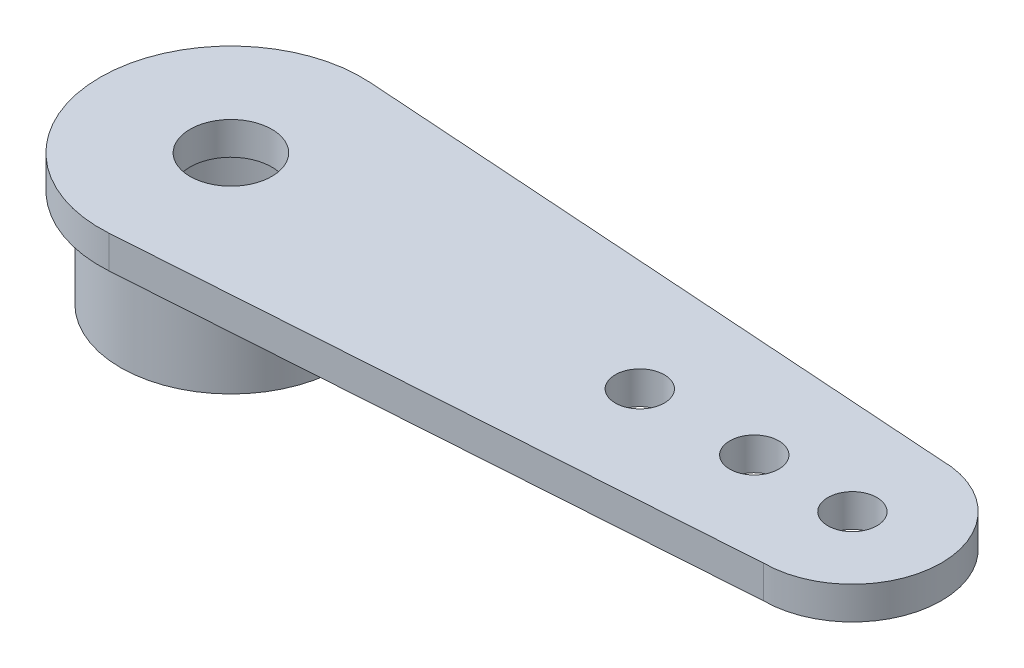
ISO-10303-21;
HEADER;
FILE_DESCRIPTION(('STEP AP214'),'2;1');
FILE_NAME('part.step','',(''),(''),'','','');
FILE_SCHEMA(('AUTOMOTIVE_DESIGN { 1 0 10303 214 1 1 1 1 }'));
ENDSEC;
DATA;
#1=APPLICATION_CONTEXT('core data for automotive mechanical design processes');
#2=APPLICATION_PROTOCOL_DEFINITION('international standard','automotive_design',2000,#1);
#3=PRODUCT_CONTEXT('',#1,'mechanical');
#4=PRODUCT('Part','Part','',(#3));
#5=PRODUCT_RELATED_PRODUCT_CATEGORY('part','',(#4));
#6=PRODUCT_DEFINITION_FORMATION('','',#4);
#7=PRODUCT_DEFINITION_CONTEXT('part definition',#1,'design');
#8=PRODUCT_DEFINITION('design','',#6,#7);
#9=PRODUCT_DEFINITION_SHAPE('','',#8);
#10=(LENGTH_UNIT() NAMED_UNIT(*) SI_UNIT(.MILLI.,.METRE.));
#11=(NAMED_UNIT(*) PLANE_ANGLE_UNIT() SI_UNIT($,.RADIAN.));
#12=(NAMED_UNIT(*) SI_UNIT($,.STERADIAN.) SOLID_ANGLE_UNIT());
#13=UNCERTAINTY_MEASURE_WITH_UNIT(LENGTH_MEASURE(1.E-05),#10,'distance_accuracy_value','');
#14=(GEOMETRIC_REPRESENTATION_CONTEXT(3) GLOBAL_UNCERTAINTY_ASSIGNED_CONTEXT((#13)) GLOBAL_UNIT_ASSIGNED_CONTEXT((#10,
#11,#12)) REPRESENTATION_CONTEXT('',''));
#15=CARTESIAN_POINT('',(0.,0.,0.));
#16=DIRECTION('',(0.,0.,1.));
#17=DIRECTION('',(1.,0.,0.));
#18=AXIS2_PLACEMENT_3D('',#15,#16,#17);
#19=CARTESIAN_POINT('',(0.,0.,0.));
#20=DIRECTION('',(0.,1.,0.));
#21=DIRECTION('',(0.,0.,1.));
#22=AXIS2_PLACEMENT_3D('',#19,#20,#21);
#23=PLANE('',#22);
#24=CARTESIAN_POINT('',(0.,0.,0.));
#25=DIRECTION('',(0.,1.,0.));
#26=DIRECTION('',(0.,0.,1.));
#27=AXIS2_PLACEMENT_3D('',#24,#25,#26);
#28=CIRCLE('',#27,3.429);
#29=CARTESIAN_POINT('',(0.,0.,-3.429));
#30=VERTEX_POINT('',#29);
#31=EDGE_CURVE('E37',#30,#30,#28,.T.);
#32=ORIENTED_EDGE('',*,*,#31,.F.);
#33=EDGE_LOOP('',(#32));
#34=FACE_BOUND('',#33,.T.);
#35=CARTESIAN_POINT('',(0.,0.,0.));
#36=DIRECTION('',(0.,1.,0.));
#37=DIRECTION('',(0.,0.,1.));
#38=AXIS2_PLACEMENT_3D('',#35,#36,#37);
#39=CIRCLE('',#38,2.794);
#40=CARTESIAN_POINT('',(0.,0.,-2.794));
#41=VERTEX_POINT('',#40);
#42=EDGE_CURVE('E138',#41,#41,#39,.T.);
#43=ORIENTED_EDGE('',*,*,#42,.T.);
#44=EDGE_LOOP('',(#43));
#45=FACE_BOUND('',#44,.T.);
#46=ADVANCED_FACE('F33',(#34,#45),#23,.F.);
#47=CARTESIAN_POINT('',(0.,3.048,0.));
#48=DIRECTION('',(0.,-1.,0.));
#49=DIRECTION('',(0.,0.,-1.));
#50=AXIS2_PLACEMENT_3D('',#47,#48,#49);
#51=CYLINDRICAL_SURFACE('',#50,3.429);
#52=CARTESIAN_POINT('',(0.,3.048,0.));
#53=DIRECTION('',(0.,1.,0.));
#54=DIRECTION('',(0.,0.,1.));
#55=AXIS2_PLACEMENT_3D('',#52,#53,#54);
#56=CIRCLE('',#55,3.429);
#57=CARTESIAN_POINT('',(0.,3.048,-3.429));
#58=VERTEX_POINT('',#57);
#59=EDGE_CURVE('E11',#58,#58,#56,.T.);
#60=CARTESIAN_POINT('',(0.,3.048,-3.429));
#61=CARTESIAN_POINT('',(0.,3.01625,-3.429));
#62=CARTESIAN_POINT('',(0.,2.9845,-3.429));
#63=CARTESIAN_POINT('',(0.,2.921,-3.429));
#64=CARTESIAN_POINT('',(0.,2.88925,-3.429));
#65=CARTESIAN_POINT('',(0.,2.82575,-3.429));
#66=CARTESIAN_POINT('',(0.,2.794,-3.429));
#67=CARTESIAN_POINT('',(0.,2.7305,-3.429));
#68=CARTESIAN_POINT('',(0.,2.69875,-3.429));
#69=CARTESIAN_POINT('',(0.,2.63525,-3.429));
#70=CARTESIAN_POINT('',(0.,2.6035,-3.429));
#71=CARTESIAN_POINT('',(0.,2.54,-3.429));
#72=CARTESIAN_POINT('',(0.,2.50825,-3.429));
#73=CARTESIAN_POINT('',(0.,2.44475,-3.429));
#74=CARTESIAN_POINT('',(0.,2.413,-3.429));
#75=CARTESIAN_POINT('',(0.,2.3495,-3.429));
#76=CARTESIAN_POINT('',(0.,2.31775,-3.429));
#77=CARTESIAN_POINT('',(0.,2.25425,-3.429));
#78=CARTESIAN_POINT('',(0.,2.2225,-3.429));
#79=CARTESIAN_POINT('',(0.,2.159,-3.429));
#80=CARTESIAN_POINT('',(0.,2.12725,-3.429));
#81=CARTESIAN_POINT('',(0.,2.06375,-3.429));
#82=CARTESIAN_POINT('',(0.,2.032,-3.429));
#83=CARTESIAN_POINT('',(0.,1.9685,-3.429));
#84=CARTESIAN_POINT('',(0.,1.93675,-3.429));
#85=CARTESIAN_POINT('',(0.,1.87325,-3.429));
#86=CARTESIAN_POINT('',(0.,1.8415,-3.429));
#87=CARTESIAN_POINT('',(0.,1.778,-3.429));
#88=CARTESIAN_POINT('',(0.,1.74625,-3.429));
#89=CARTESIAN_POINT('',(0.,1.68275,-3.429));
#90=CARTESIAN_POINT('',(0.,1.651,-3.429));
#91=CARTESIAN_POINT('',(0.,1.5875,-3.429));
#92=CARTESIAN_POINT('',(0.,1.55575,-3.429));
#93=CARTESIAN_POINT('',(0.,1.49225,-3.429));
#94=CARTESIAN_POINT('',(0.,1.4605,-3.429));
#95=CARTESIAN_POINT('',(0.,1.397,-3.429));
#96=CARTESIAN_POINT('',(0.,1.36525,-3.429));
#97=CARTESIAN_POINT('',(0.,1.30175,-3.429));
#98=CARTESIAN_POINT('',(0.,1.27,-3.429));
#99=CARTESIAN_POINT('',(0.,1.2065,-3.429));
#100=CARTESIAN_POINT('',(0.,1.17475,-3.429));
#101=CARTESIAN_POINT('',(0.,1.11125,-3.429));
#102=CARTESIAN_POINT('',(0.,1.0795,-3.429));
#103=CARTESIAN_POINT('',(0.,1.016,-3.429));
#104=CARTESIAN_POINT('',(0.,0.98425,-3.429));
#105=CARTESIAN_POINT('',(0.,0.92075,-3.429));
#106=CARTESIAN_POINT('',(0.,0.889,-3.429));
#107=CARTESIAN_POINT('',(0.,0.8255,-3.429));
#108=CARTESIAN_POINT('',(0.,0.79375,-3.429));
#109=CARTESIAN_POINT('',(0.,0.73025,-3.429));
#110=CARTESIAN_POINT('',(0.,0.6985,-3.429));
#111=CARTESIAN_POINT('',(0.,0.635,-3.429));
#112=CARTESIAN_POINT('',(0.,0.60325,-3.429));
#113=CARTESIAN_POINT('',(0.,0.53975,-3.429));
#114=CARTESIAN_POINT('',(0.,0.508,-3.429));
#115=CARTESIAN_POINT('',(0.,0.4445,-3.429));
#116=CARTESIAN_POINT('',(0.,0.41275,-3.429));
#117=CARTESIAN_POINT('',(0.,0.34925,-3.429));
#118=CARTESIAN_POINT('',(0.,0.3175,-3.429));
#119=CARTESIAN_POINT('',(0.,0.254,-3.429));
#120=CARTESIAN_POINT('',(0.,0.22225,-3.429));
#121=CARTESIAN_POINT('',(0.,0.15875,-3.429));
#122=CARTESIAN_POINT('',(0.,0.127,-3.429));
#123=CARTESIAN_POINT('',(0.,0.0634999999999999,-3.429));
#124=CARTESIAN_POINT('',(0.,0.03175,-3.429));
#125=CARTESIAN_POINT('',(0.,0.,-3.429));
#126=B_SPLINE_CURVE_WITH_KNOTS('',3,(#60,#61,#62,#63,#64,#65,#66,#67,#68,#69,#70,#71,#72,#73,
#74,#75,#76,#77,#78,#79,#80,#81,#82,#83,#84,#85,#86,#87,#88,#89,#90,#91,#92,#93,#94,#95,#96,#97,
#98,#99,#100,#101,#102,#103,#104,#105,#106,#107,#108,#109,#110,#111,#112,#113,#114,#115,#116,
#117,#118,#119,#120,#121,#122,#123,#124,#125),.UNSPECIFIED.,.F.,.F.,(4,2,2,2,2,2,2,2,2,2,2,2,2,
2,2,2,2,2,2,2,2,2,2,2,2,2,2,2,2,2,2,2,4),(0.,0.0952500000000003,0.1905,0.28575,0.381,0.47625,
0.5715,0.66675,0.762,0.85725,0.9525,1.04775,1.143,1.23825,1.3335,1.42875,1.524,1.61925,1.7145,
1.80975,1.905,2.00025,2.0955,2.19075,2.286,2.38125,2.4765,2.57175,2.667,2.76225,2.8575,2.95275,
3.048),.UNSPECIFIED.);
#127=EDGE_CURVE('BSEAM35',#58,#30,#126,.T.);
#128=ORIENTED_EDGE('',*,*,#59,.F.);
#129=ORIENTED_EDGE('',*,*,#31,.T.);
#130=ORIENTED_EDGE('',*,*,#127,.T.);
#131=ORIENTED_EDGE('',*,*,#127,.F.);
#132=EDGE_LOOP('',(#128,#130,#129,#131));
#133=FACE_BOUND('',#132,.T.);
#134=ADVANCED_FACE('F35',(#133),#51,.T.);
#135=CARTESIAN_POINT('',(0.,3.048,0.));
#136=DIRECTION('',(0.,-1.,0.));
#137=DIRECTION('',(0.,0.,-1.));
#138=AXIS2_PLACEMENT_3D('',#135,#136,#137);
#139=CYLINDRICAL_SURFACE('',#138,2.794);
#140=CARTESIAN_POINT('',(0.,3.048,0.));
#141=DIRECTION('',(0.,1.,0.));
#142=DIRECTION('',(0.,0.,1.));
#143=AXIS2_PLACEMENT_3D('',#140,#141,#142);
#144=CIRCLE('',#143,2.794);
#145=CARTESIAN_POINT('',(0.,3.048,-2.794));
#146=VERTEX_POINT('',#145);
#147=EDGE_CURVE('E135',#146,#146,#144,.T.);
#148=CARTESIAN_POINT('',(0.,3.048,-2.794));
#149=CARTESIAN_POINT('',(0.,3.01625,-2.794));
#150=CARTESIAN_POINT('',(0.,2.9845,-2.794));
#151=CARTESIAN_POINT('',(0.,2.921,-2.794));
#152=CARTESIAN_POINT('',(0.,2.88925,-2.794));
#153=CARTESIAN_POINT('',(0.,2.82575,-2.794));
#154=CARTESIAN_POINT('',(0.,2.794,-2.794));
#155=CARTESIAN_POINT('',(0.,2.7305,-2.794));
#156=CARTESIAN_POINT('',(0.,2.69875,-2.794));
#157=CARTESIAN_POINT('',(0.,2.63525,-2.794));
#158=CARTESIAN_POINT('',(0.,2.6035,-2.794));
#159=CARTESIAN_POINT('',(0.,2.54,-2.794));
#160=CARTESIAN_POINT('',(0.,2.50825,-2.794));
#161=CARTESIAN_POINT('',(0.,2.44475,-2.794));
#162=CARTESIAN_POINT('',(0.,2.413,-2.794));
#163=CARTESIAN_POINT('',(0.,2.3495,-2.794));
#164=CARTESIAN_POINT('',(0.,2.31775,-2.794));
#165=CARTESIAN_POINT('',(0.,2.25425,-2.794));
#166=CARTESIAN_POINT('',(0.,2.2225,-2.794));
#167=CARTESIAN_POINT('',(0.,2.159,-2.794));
#168=CARTESIAN_POINT('',(0.,2.12725,-2.794));
#169=CARTESIAN_POINT('',(0.,2.06375,-2.794));
#170=CARTESIAN_POINT('',(0.,2.032,-2.794));
#171=CARTESIAN_POINT('',(0.,1.9685,-2.794));
#172=CARTESIAN_POINT('',(0.,1.93675,-2.794));
#173=CARTESIAN_POINT('',(0.,1.87325,-2.794));
#174=CARTESIAN_POINT('',(0.,1.8415,-2.794));
#175=CARTESIAN_POINT('',(0.,1.778,-2.794));
#176=CARTESIAN_POINT('',(0.,1.74625,-2.794));
#177=CARTESIAN_POINT('',(0.,1.68275,-2.794));
#178=CARTESIAN_POINT('',(0.,1.651,-2.794));
#179=CARTESIAN_POINT('',(0.,1.5875,-2.794));
#180=CARTESIAN_POINT('',(0.,1.55575,-2.794));
#181=CARTESIAN_POINT('',(0.,1.49225,-2.794));
#182=CARTESIAN_POINT('',(0.,1.4605,-2.794));
#183=CARTESIAN_POINT('',(0.,1.397,-2.794));
#184=CARTESIAN_POINT('',(0.,1.36525,-2.794));
#185=CARTESIAN_POINT('',(0.,1.30175,-2.794));
#186=CARTESIAN_POINT('',(0.,1.27,-2.794));
#187=CARTESIAN_POINT('',(0.,1.2065,-2.794));
#188=CARTESIAN_POINT('',(0.,1.17475,-2.794));
#189=CARTESIAN_POINT('',(0.,1.11125,-2.794));
#190=CARTESIAN_POINT('',(0.,1.0795,-2.794));
#191=CARTESIAN_POINT('',(0.,1.016,-2.794));
#192=CARTESIAN_POINT('',(0.,0.98425,-2.794));
#193=CARTESIAN_POINT('',(0.,0.92075,-2.794));
#194=CARTESIAN_POINT('',(0.,0.889,-2.794));
#195=CARTESIAN_POINT('',(0.,0.8255,-2.794));
#196=CARTESIAN_POINT('',(0.,0.79375,-2.794));
#197=CARTESIAN_POINT('',(0.,0.73025,-2.794));
#198=CARTESIAN_POINT('',(0.,0.6985,-2.794));
#199=CARTESIAN_POINT('',(0.,0.635,-2.794));
#200=CARTESIAN_POINT('',(0.,0.60325,-2.794));
#201=CARTESIAN_POINT('',(0.,0.53975,-2.794));
#202=CARTESIAN_POINT('',(0.,0.508,-2.794));
#203=CARTESIAN_POINT('',(0.,0.4445,-2.794));
#204=CARTESIAN_POINT('',(0.,0.41275,-2.794));
#205=CARTESIAN_POINT('',(0.,0.34925,-2.794));
#206=CARTESIAN_POINT('',(0.,0.3175,-2.794));
#207=CARTESIAN_POINT('',(0.,0.254,-2.794));
#208=CARTESIAN_POINT('',(0.,0.22225,-2.794));
#209=CARTESIAN_POINT('',(0.,0.15875,-2.794));
#210=CARTESIAN_POINT('',(0.,0.127,-2.794));
#211=CARTESIAN_POINT('',(0.,0.0634999999999999,-2.794));
#212=CARTESIAN_POINT('',(0.,0.03175,-2.794));
#213=CARTESIAN_POINT('',(0.,0.,-2.794));
#214=B_SPLINE_CURVE_WITH_KNOTS('',3,(#148,#149,#150,#151,#152,#153,#154,#155,#156,#157,#158,
#159,#160,#161,#162,#163,#164,#165,#166,#167,#168,#169,#170,#171,#172,#173,#174,#175,#176,#177,
#178,#179,#180,#181,#182,#183,#184,#185,#186,#187,#188,#189,#190,#191,#192,#193,#194,#195,#196,
#197,#198,#199,#200,#201,#202,#203,#204,#205,#206,#207,#208,#209,#210,#211,#212,#213),
.UNSPECIFIED.,.F.,.F.,(4,2,2,2,2,2,2,2,2,2,2,2,2,2,2,2,2,2,2,2,2,2,2,2,2,2,2,2,2,2,2,2,4),(0.,
0.0952499999999998,0.1905,0.28575,0.381,0.47625,0.5715,0.66675,0.762,0.85725,0.9525,1.04775,
1.143,1.23825,1.3335,1.42875,1.524,1.61925,1.7145,1.80975,1.905,2.00025,2.0955,2.19075,2.286,
2.38125,2.4765,2.57175,2.667,2.76225,2.8575,2.95275,3.048),.UNSPECIFIED.);
#215=EDGE_CURVE('BSEAM150',#146,#41,#214,.T.);
#216=ORIENTED_EDGE('',*,*,#147,.T.);
#217=ORIENTED_EDGE('',*,*,#42,.F.);
#218=ORIENTED_EDGE('',*,*,#215,.T.);
#219=ORIENTED_EDGE('',*,*,#215,.F.);
#220=EDGE_LOOP('',(#216,#218,#217,#219));
#221=FACE_BOUND('',#220,.T.);
#222=ADVANCED_FACE('F150',(#221),#139,.F.);
#223=CARTESIAN_POINT('',(0.,3.048,0.));
#224=DIRECTION('',(0.,1.,0.));
#225=DIRECTION('',(0.,0.,1.));
#226=AXIS2_PLACEMENT_3D('',#223,#224,#225);
#227=PLANE('',#226);
#228=CARTESIAN_POINT('',(0.,3.048,0.));
#229=DIRECTION('',(0.,1.,0.));
#230=DIRECTION('',(0.,0.,1.));
#231=AXIS2_PLACEMENT_3D('',#228,#229,#230);
#232=CIRCLE('',#231,1.27);
#233=CARTESIAN_POINT('',(0.,3.048,1.27));
#234=VERTEX_POINT('',#233);
#235=EDGE_CURVE('E129',#234,#234,#232,.T.);
#236=ORIENTED_EDGE('',*,*,#235,.T.);
#237=EDGE_LOOP('',(#236));
#238=FACE_BOUND('',#237,.T.);
#239=ORIENTED_EDGE('',*,*,#147,.F.);
#240=EDGE_LOOP('',(#239));
#241=FACE_BOUND('',#240,.T.);
#242=ADVANCED_FACE('F155',(#238,#241),#227,.F.);
#243=CARTESIAN_POINT('',(0.275010075550156,4.064,-4.05468438455398));
#244=DIRECTION('',(-0.0676698020546643,0.,0.997707771789858));
#245=DIRECTION('',(0.997707771789858,0.,0.0676698020546643));
#246=AXIS2_PLACEMENT_3D('',#243,#244,#245);
#247=PLANE('',#246);
#248=DIRECTION('',(-0.997707771789858,0.,-0.0676698020546643));
#249=VECTOR('',#248,1.);
#250=CARTESIAN_POINT('',(0.275010075550156,3.048,-4.05468438455398));
#251=LINE('',#250,#249);
#252=CARTESIAN_POINT('',(19.304,3.048,-2.76403794689));
#253=VERTEX_POINT('',#252);
#254=CARTESIAN_POINT('',(0.275010075550156,3.048,-4.05468438455398));
#255=VERTEX_POINT('',#254);
#256=EDGE_CURVE('E113',#253,#255,#251,.T.);
#257=ORIENTED_EDGE('',*,*,#256,.T.);
#258=DIRECTION('',(0.,-1.,0.));
#259=VECTOR('',#258,1.);
#260=CARTESIAN_POINT('',(0.275010075550156,4.064,-4.05468438455398));
#261=LINE('',#260,#259);
#262=CARTESIAN_POINT('',(0.275010075550156,4.064,-4.05468438455398));
#263=VERTEX_POINT('',#262);
#264=EDGE_CURVE('E93',#263,#255,#261,.T.);
#265=ORIENTED_EDGE('',*,*,#264,.F.);
#266=DIRECTION('',(-0.997707771789858,0.,-0.0676698020546643));
#267=VECTOR('',#266,1.);
#268=CARTESIAN_POINT('',(0.275010075550156,4.064,-4.05468438455398));
#269=LINE('',#268,#267);
#270=CARTESIAN_POINT('',(19.304,4.064,-2.76403794689));
#271=VERTEX_POINT('',#270);
#272=EDGE_CURVE('E83',#271,#263,#269,.T.);
#273=ORIENTED_EDGE('',*,*,#272,.F.);
#274=DIRECTION('',(0.,-1.,0.));
#275=VECTOR('',#274,1.);
#276=CARTESIAN_POINT('',(19.304,4.064,-2.76403794689));
#277=LINE('',#276,#275);
#278=EDGE_CURVE('E112',#271,#253,#277,.T.);
#279=ORIENTED_EDGE('',*,*,#278,.T.);
#280=EDGE_LOOP('',(#257,#265,#273,#279));
#281=FACE_BOUND('',#280,.T.);
#282=ADVANCED_FACE('F157',(#281),#247,.F.);
#283=CARTESIAN_POINT('',(0.,4.064,0.));
#284=DIRECTION('',(0.,-1.,0.));
#285=DIRECTION('',(0.,0.,-1.));
#286=AXIS2_PLACEMENT_3D('',#283,#284,#285);
#287=CYLINDRICAL_SURFACE('',#286,4.064);
#288=CARTESIAN_POINT('',(0.,3.048,0.));
#289=DIRECTION('',(0.,1.,0.));
#290=DIRECTION('',(0.,0.,1.));
#291=AXIS2_PLACEMENT_3D('',#288,#289,#290);
#292=CIRCLE('',#291,4.064);
#293=CARTESIAN_POINT('',(0.275010075550156,3.048,4.05468438455398));
#294=VERTEX_POINT('',#293);
#295=EDGE_CURVE('E89',#255,#294,#292,.T.);
#296=ORIENTED_EDGE('',*,*,#295,.T.);
#297=DIRECTION('',(0.,-1.,0.));
#298=VECTOR('',#297,1.);
#299=CARTESIAN_POINT('',(0.275010075550156,4.064,4.05468438455398));
#300=LINE('',#299,#298);
#301=CARTESIAN_POINT('',(0.275010075550156,4.064,4.05468438455398));
#302=VERTEX_POINT('',#301);
#303=EDGE_CURVE('E87',#302,#294,#300,.T.);
#304=ORIENTED_EDGE('',*,*,#303,.F.);
#305=CARTESIAN_POINT('',(0.,4.064,0.));
#306=DIRECTION('',(0.,1.,0.));
#307=DIRECTION('',(0.,0.,1.));
#308=AXIS2_PLACEMENT_3D('',#305,#306,#307);
#309=CIRCLE('',#308,4.064);
#310=EDGE_CURVE('E77',#263,#302,#309,.T.);
#311=ORIENTED_EDGE('',*,*,#310,.F.);
#312=ORIENTED_EDGE('',*,*,#264,.T.);
#313=EDGE_LOOP('',(#296,#304,#311,#312));
#314=FACE_BOUND('',#313,.T.);
#315=ADVANCED_FACE('F88',(#314),#287,.T.);
#316=CARTESIAN_POINT('',(0.275010075550156,4.064,4.05468438455398));
#317=DIRECTION('',(0.0676698020546643,0.,0.997707771789858));
#318=DIRECTION('',(0.997707771789858,0.,-0.0676698020546643));
#319=AXIS2_PLACEMENT_3D('',#316,#317,#318);
#320=PLANE('',#319);
#321=DIRECTION('',(-0.997707771789858,0.,0.0676698020546643));
#322=VECTOR('',#321,1.);
#323=CARTESIAN_POINT('',(0.275010075550156,3.048,4.05468438455398));
#324=LINE('',#323,#322);
#325=CARTESIAN_POINT('',(19.304,3.048,2.76403794689));
#326=VERTEX_POINT('',#325);
#327=EDGE_CURVE('E117',#326,#294,#324,.T.);
#328=ORIENTED_EDGE('',*,*,#327,.F.);
#329=DIRECTION('',(0.,-1.,0.));
#330=VECTOR('',#329,1.);
#331=CARTESIAN_POINT('',(19.304,4.064,2.76403794689));
#332=LINE('',#331,#330);
#333=CARTESIAN_POINT('',(19.304,4.064,2.76403794689));
#334=VERTEX_POINT('',#333);
#335=EDGE_CURVE('E66',#334,#326,#332,.T.);
#336=ORIENTED_EDGE('',*,*,#335,.F.);
#337=DIRECTION('',(-0.997707771789858,0.,0.0676698020546643));
#338=VECTOR('',#337,1.);
#339=CARTESIAN_POINT('',(0.275010075550156,4.064,4.05468438455398));
#340=LINE('',#339,#338);
#341=EDGE_CURVE('E81',#334,#302,#340,.T.);
#342=ORIENTED_EDGE('',*,*,#341,.T.);
#343=ORIENTED_EDGE('',*,*,#303,.T.);
#344=EDGE_LOOP('',(#328,#336,#342,#343));
#345=FACE_BOUND('',#344,.T.);
#346=ADVANCED_FACE('F95',(#345),#320,.T.);
#347=CARTESIAN_POINT('',(19.304,4.064,0.));
#348=DIRECTION('',(0.,-1.,0.));
#349=DIRECTION('',(0.,0.,-1.));
#350=AXIS2_PLACEMENT_3D('',#347,#348,#349);
#351=CYLINDRICAL_SURFACE('',#350,0.762000000000003);
#352=CARTESIAN_POINT('',(19.304,4.064,0.));
#353=DIRECTION('',(0.,1.,0.));
#354=DIRECTION('',(0.,0.,1.));
#355=AXIS2_PLACEMENT_3D('',#352,#353,#354);
#356=CIRCLE('',#355,0.762000000000003);
#357=CARTESIAN_POINT('',(19.304,4.064,0.762000000000003));
#358=VERTEX_POINT('',#357);
#359=EDGE_CURVE('E106',#358,#358,#356,.T.);
#360=ORIENTED_EDGE('',*,*,#359,.T.);
#361=EDGE_LOOP('',(#360));
#362=FACE_BOUND('',#361,.T.);
#363=CARTESIAN_POINT('',(19.304,3.048,0.));
#364=DIRECTION('',(0.,1.,0.));
#365=DIRECTION('',(0.,0.,1.));
#366=AXIS2_PLACEMENT_3D('',#363,#364,#365);
#367=CIRCLE('',#366,0.762000000000003);
#368=CARTESIAN_POINT('',(19.304,3.048,0.762000000000003));
#369=VERTEX_POINT('',#368);
#370=EDGE_CURVE('E126',#369,#369,#367,.T.);
#371=ORIENTED_EDGE('',*,*,#370,.F.);
#372=EDGE_LOOP('',(#371));
#373=FACE_BOUND('',#372,.T.);
#374=ADVANCED_FACE('F165',(#362,#373),#351,.F.);
#375=CARTESIAN_POINT('',(12.7,4.064,0.));
#376=DIRECTION('',(0.,-1.,0.));
#377=DIRECTION('',(0.,0.,-1.));
#378=AXIS2_PLACEMENT_3D('',#375,#376,#377);
#379=CYLINDRICAL_SURFACE('',#378,0.762000000000001);
#380=CARTESIAN_POINT('',(12.7,4.064,0.));
#381=DIRECTION('',(0.,1.,0.));
#382=DIRECTION('',(0.,0.,1.));
#383=AXIS2_PLACEMENT_3D('',#380,#381,#382);
#384=CIRCLE('',#383,0.762000000000001);
#385=CARTESIAN_POINT('',(12.7,4.064,0.762000000000001));
#386=VERTEX_POINT('',#385);
#387=EDGE_CURVE('E103',#386,#386,#384,.T.);
#388=ORIENTED_EDGE('',*,*,#387,.T.);
#389=EDGE_LOOP('',(#388));
#390=FACE_BOUND('',#389,.T.);
#391=CARTESIAN_POINT('',(12.7,3.048,0.));
#392=DIRECTION('',(0.,1.,0.));
#393=DIRECTION('',(0.,0.,1.));
#394=AXIS2_PLACEMENT_3D('',#391,#392,#393);
#395=CIRCLE('',#394,0.762000000000001);
#396=CARTESIAN_POINT('',(12.7,3.048,0.762000000000001));
#397=VERTEX_POINT('',#396);
#398=EDGE_CURVE('E123',#397,#397,#395,.T.);
#399=ORIENTED_EDGE('',*,*,#398,.F.);
#400=EDGE_LOOP('',(#399));
#401=FACE_BOUND('',#400,.T.);
#402=ADVANCED_FACE('F173',(#390,#401),#379,.F.);
#403=CARTESIAN_POINT('',(16.256,4.064,0.));
#404=DIRECTION('',(0.,-1.,0.));
#405=DIRECTION('',(0.,0.,-1.));
#406=AXIS2_PLACEMENT_3D('',#403,#404,#405);
#407=CYLINDRICAL_SURFACE('',#406,0.762000000000003);
#408=CARTESIAN_POINT('',(16.256,4.064,0.));
#409=DIRECTION('',(0.,1.,0.));
#410=DIRECTION('',(0.,0.,1.));
#411=AXIS2_PLACEMENT_3D('',#408,#409,#410);
#412=CIRCLE('',#411,0.762000000000003);
#413=CARTESIAN_POINT('',(16.256,4.064,0.762000000000003));
#414=VERTEX_POINT('',#413);
#415=EDGE_CURVE('E97',#414,#414,#412,.T.);
#416=ORIENTED_EDGE('',*,*,#415,.T.);
#417=EDGE_LOOP('',(#416));
#418=FACE_BOUND('',#417,.T.);
#419=CARTESIAN_POINT('',(16.256,3.048,0.));
#420=DIRECTION('',(0.,1.,0.));
#421=DIRECTION('',(0.,0.,1.));
#422=AXIS2_PLACEMENT_3D('',#419,#420,#421);
#423=CIRCLE('',#422,0.762000000000003);
#424=CARTESIAN_POINT('',(16.256,3.048,0.762000000000003));
#425=VERTEX_POINT('',#424);
#426=EDGE_CURVE('E120',#425,#425,#423,.T.);
#427=ORIENTED_EDGE('',*,*,#426,.F.);
#428=EDGE_LOOP('',(#427));
#429=FACE_BOUND('',#428,.T.);
#430=ADVANCED_FACE('F170',(#418,#429),#407,.F.);
#431=CARTESIAN_POINT('',(19.304,4.064,0.));
#432=DIRECTION('',(0.,-1.,0.));
#433=DIRECTION('',(0.,0.,-1.));
#434=AXIS2_PLACEMENT_3D('',#431,#432,#433);
#435=CYLINDRICAL_SURFACE('',#434,2.76403794688747);
#436=CARTESIAN_POINT('',(19.304,3.048,0.));
#437=DIRECTION('',(0.,1.,0.));
#438=DIRECTION('',(0.,0.,1.));
#439=AXIS2_PLACEMENT_3D('',#436,#437,#438);
#440=CIRCLE('',#439,2.76403794688747);
#441=EDGE_CURVE('E69',#326,#253,#440,.T.);
#442=ORIENTED_EDGE('',*,*,#441,.T.);
#443=ORIENTED_EDGE('',*,*,#278,.F.);
#444=CARTESIAN_POINT('',(19.304,4.064,0.));
#445=DIRECTION('',(0.,1.,0.));
#446=DIRECTION('',(0.,0.,1.));
#447=AXIS2_PLACEMENT_3D('',#444,#445,#446);
#448=CIRCLE('',#447,2.76403794688747);
#449=EDGE_CURVE('E50',#334,#271,#448,.T.);
#450=ORIENTED_EDGE('',*,*,#449,.F.);
#451=ORIENTED_EDGE('',*,*,#335,.T.);
#452=EDGE_LOOP('',(#442,#443,#450,#451));
#453=FACE_BOUND('',#452,.T.);
#454=ADVANCED_FACE('F166',(#453),#435,.T.);
#455=CARTESIAN_POINT('',(0.,4.064,0.));
#456=DIRECTION('',(0.,-1.,0.));
#457=DIRECTION('',(0.,0.,-1.));
#458=AXIS2_PLACEMENT_3D('',#455,#456,#457);
#459=CYLINDRICAL_SURFACE('',#458,1.27);
#460=CARTESIAN_POINT('',(0.,4.064,0.));
#461=DIRECTION('',(0.,1.,0.));
#462=DIRECTION('',(0.,0.,1.));
#463=AXIS2_PLACEMENT_3D('',#460,#461,#462);
#464=CIRCLE('',#463,1.27);
#465=CARTESIAN_POINT('',(0.,4.064,1.27));
#466=VERTEX_POINT('',#465);
#467=EDGE_CURVE('E109',#466,#466,#464,.T.);
#468=ORIENTED_EDGE('',*,*,#467,.T.);
#469=EDGE_LOOP('',(#468));
#470=FACE_BOUND('',#469,.T.);
#471=ORIENTED_EDGE('',*,*,#235,.F.);
#472=EDGE_LOOP('',(#471));
#473=FACE_BOUND('',#472,.T.);
#474=ADVANCED_FACE('F169',(#470,#473),#459,.F.);
#475=CARTESIAN_POINT('',(0.,4.064,0.));
#476=DIRECTION('',(0.,1.,0.));
#477=DIRECTION('',(0.,0.,1.));
#478=AXIS2_PLACEMENT_3D('',#475,#476,#477);
#479=PLANE('',#478);
#480=ORIENTED_EDGE('',*,*,#272,.T.);
#481=ORIENTED_EDGE('',*,*,#310,.T.);
#482=ORIENTED_EDGE('',*,*,#341,.F.);
#483=ORIENTED_EDGE('',*,*,#449,.T.);
#484=EDGE_LOOP('',(#480,#481,#482,#483));
#485=FACE_BOUND('',#484,.T.);
#486=ORIENTED_EDGE('',*,*,#415,.F.);
#487=EDGE_LOOP('',(#486));
#488=FACE_BOUND('',#487,.T.);
#489=ORIENTED_EDGE('',*,*,#387,.F.);
#490=EDGE_LOOP('',(#489));
#491=FACE_BOUND('',#490,.T.);
#492=ORIENTED_EDGE('',*,*,#359,.F.);
#493=EDGE_LOOP('',(#492));
#494=FACE_BOUND('',#493,.T.);
#495=ORIENTED_EDGE('',*,*,#467,.F.);
#496=EDGE_LOOP('',(#495));
#497=FACE_BOUND('',#496,.T.);
#498=ADVANCED_FACE('F78',(#485,#488,#491,#494,#497),#479,.T.);
#499=ORIENTED_EDGE('',*,*,#59,.T.);
#500=EDGE_LOOP('',(#499));
#501=FACE_BOUND('',#500,.T.);
#502=ORIENTED_EDGE('',*,*,#256,.F.);
#503=ORIENTED_EDGE('',*,*,#441,.F.);
#504=ORIENTED_EDGE('',*,*,#327,.T.);
#505=ORIENTED_EDGE('',*,*,#295,.F.);
#506=EDGE_LOOP('',(#502,#503,#504,#505));
#507=FACE_BOUND('',#506,.T.);
#508=ORIENTED_EDGE('',*,*,#426,.T.);
#509=EDGE_LOOP('',(#508));
#510=FACE_BOUND('',#509,.T.);
#511=ORIENTED_EDGE('',*,*,#398,.T.);
#512=EDGE_LOOP('',(#511));
#513=FACE_BOUND('',#512,.T.);
#514=ORIENTED_EDGE('',*,*,#370,.T.);
#515=EDGE_LOOP('',(#514));
#516=FACE_BOUND('',#515,.T.);
#517=ADVANCED_FACE('F184',(#501,#507,#510,#513,#516),#227,.F.);
#518=CLOSED_SHELL('',(#46,#134,#222,#242,#282,#315,#346,#374,#402,#430,#454,#474,#498,#517));
#519=MANIFOLD_SOLID_BREP('B2',#518);
#520=ADVANCED_BREP_SHAPE_REPRESENTATION('',(#18,#519),#14);
#521=SHAPE_DEFINITION_REPRESENTATION(#9,#520);
ENDSEC;
END-ISO-10303-21;
